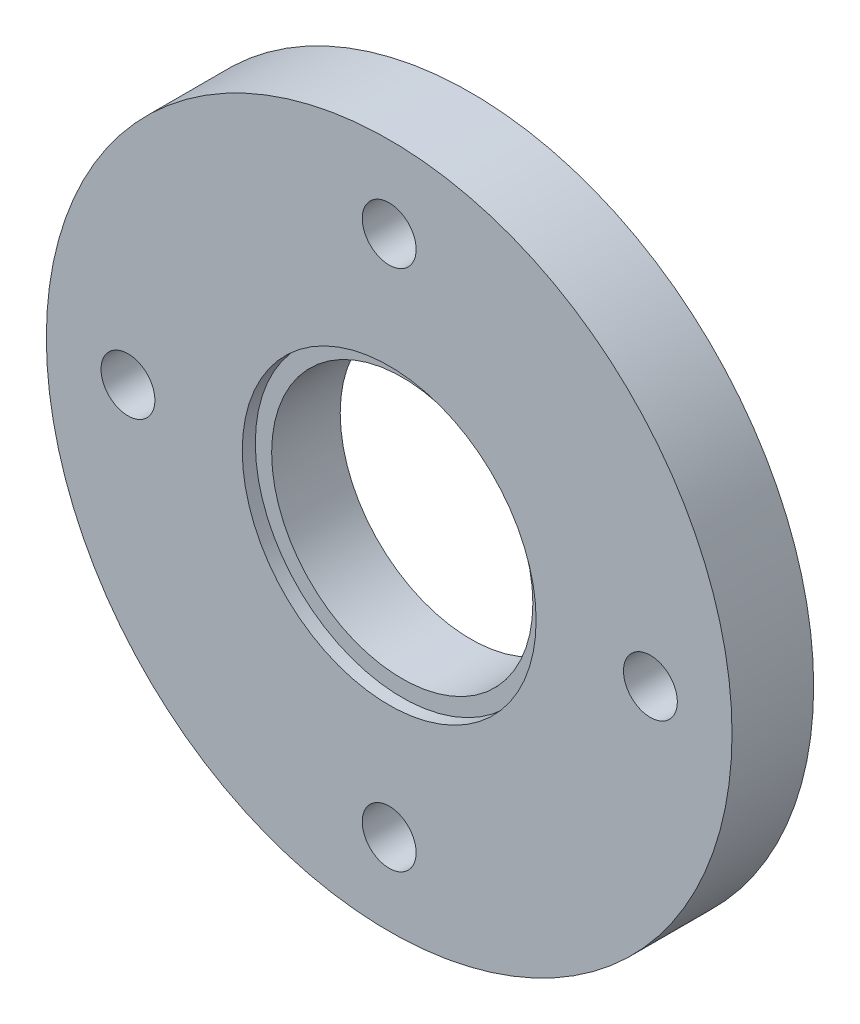
ISO-10303-21;
HEADER;
FILE_DESCRIPTION(('STEP AP214'),'2;1');
FILE_NAME('part.step','',(''),(''),'','','');
FILE_SCHEMA(('AUTOMOTIVE_DESIGN { 1 0 10303 214 1 1 1 1 }'));
ENDSEC;
DATA;
#1=APPLICATION_CONTEXT('core data for automotive mechanical design processes');
#2=APPLICATION_PROTOCOL_DEFINITION('international standard','automotive_design',2000,#1);
#3=PRODUCT_CONTEXT('',#1,'mechanical');
#4=PRODUCT('Part','Part','',(#3));
#5=PRODUCT_RELATED_PRODUCT_CATEGORY('part','',(#4));
#6=PRODUCT_DEFINITION_FORMATION('','',#4);
#7=PRODUCT_DEFINITION_CONTEXT('part definition',#1,'design');
#8=PRODUCT_DEFINITION('design','',#6,#7);
#9=PRODUCT_DEFINITION_SHAPE('','',#8);
#10=(LENGTH_UNIT() NAMED_UNIT(*) SI_UNIT(.MILLI.,.METRE.));
#11=(NAMED_UNIT(*) PLANE_ANGLE_UNIT() SI_UNIT($,.RADIAN.));
#12=(NAMED_UNIT(*) SI_UNIT($,.STERADIAN.) SOLID_ANGLE_UNIT());
#13=UNCERTAINTY_MEASURE_WITH_UNIT(LENGTH_MEASURE(1.E-05),#10,'distance_accuracy_value','');
#14=(GEOMETRIC_REPRESENTATION_CONTEXT(3) GLOBAL_UNCERTAINTY_ASSIGNED_CONTEXT((#13)) GLOBAL_UNIT_ASSIGNED_CONTEXT((#10,
#11,#12)) REPRESENTATION_CONTEXT('',''));
#15=CARTESIAN_POINT('',(0.,0.,0.));
#16=DIRECTION('',(0.,0.,1.));
#17=DIRECTION('',(1.,0.,0.));
#18=AXIS2_PLACEMENT_3D('',#15,#16,#17);
#19=CARTESIAN_POINT('',(0.,0.,5.));
#20=DIRECTION('',(0.,0.,-1.));
#21=DIRECTION('',(-1.,0.,0.));
#22=AXIS2_PLACEMENT_3D('',#19,#20,#21);
#23=CYLINDRICAL_SURFACE('',#22,8.);
#24=CARTESIAN_POINT('',(0.,0.,0.));
#25=DIRECTION('',(0.,0.,1.));
#26=DIRECTION('',(1.,0.,0.));
#27=AXIS2_PLACEMENT_3D('',#24,#25,#26);
#28=CIRCLE('',#27,8.);
#29=CARTESIAN_POINT('',(8.,0.,0.));
#30=VERTEX_POINT('',#29);
#31=EDGE_CURVE('E48',#30,#30,#28,.T.);
#32=ORIENTED_EDGE('',*,*,#31,.F.);
#33=EDGE_LOOP('',(#32));
#34=FACE_BOUND('',#33,.T.);
#35=CARTESIAN_POINT('',(0.,0.,4.2));
#36=DIRECTION('',(0.,0.,1.));
#37=DIRECTION('',(1.,0.,0.));
#38=AXIS2_PLACEMENT_3D('',#35,#36,#37);
#39=CIRCLE('',#38,8.);
#40=CARTESIAN_POINT('',(8.,0.,4.2));
#41=VERTEX_POINT('',#40);
#42=EDGE_CURVE('E39',#41,#41,#39,.T.);
#43=ORIENTED_EDGE('',*,*,#42,.T.);
#44=EDGE_LOOP('',(#43));
#45=FACE_BOUND('',#44,.T.);
#46=ADVANCED_FACE('F35',(#34,#45),#23,.F.);
#47=CARTESIAN_POINT('',(0.,0.,5.));
#48=DIRECTION('',(0.,0.,1.));
#49=DIRECTION('',(1.,0.,0.));
#50=AXIS2_PLACEMENT_3D('',#47,#48,#49);
#51=PLANE('',#50);
#52=CARTESIAN_POINT('',(0.,0.,5.));
#53=DIRECTION('',(0.,0.,1.));
#54=DIRECTION('',(1.,0.,0.));
#55=AXIS2_PLACEMENT_3D('',#52,#53,#54);
#56=CIRCLE('',#55,9.);
#57=CARTESIAN_POINT('',(9.,0.,5.));
#58=VERTEX_POINT('',#57);
#59=EDGE_CURVE('E76',#58,#58,#56,.T.);
#60=ORIENTED_EDGE('',*,*,#59,.F.);
#61=EDGE_LOOP('',(#60));
#62=FACE_BOUND('',#61,.T.);
#63=CARTESIAN_POINT('',(0.,16.,5.));
#64=DIRECTION('',(0.,0.,1.));
#65=DIRECTION('',(1.,0.,0.));
#66=AXIS2_PLACEMENT_3D('',#63,#64,#65);
#67=CIRCLE('',#66,1.64999999999999);
#68=CARTESIAN_POINT('',(1.64999999999999,16.,5.));
#69=VERTEX_POINT('',#68);
#70=EDGE_CURVE('E73',#69,#69,#67,.T.);
#71=ORIENTED_EDGE('',*,*,#70,.F.);
#72=EDGE_LOOP('',(#71));
#73=FACE_BOUND('',#72,.T.);
#74=CARTESIAN_POINT('',(-16.,0.,5.));
#75=DIRECTION('',(0.,0.,1.));
#76=DIRECTION('',(1.,0.,0.));
#77=AXIS2_PLACEMENT_3D('',#74,#75,#76);
#78=CIRCLE('',#77,1.64999999999999);
#79=CARTESIAN_POINT('',(-14.35,0.,5.));
#80=VERTEX_POINT('',#79);
#81=EDGE_CURVE('E67',#80,#80,#78,.T.);
#82=ORIENTED_EDGE('',*,*,#81,.F.);
#83=EDGE_LOOP('',(#82));
#84=FACE_BOUND('',#83,.T.);
#85=CARTESIAN_POINT('',(0.,-16.,5.));
#86=DIRECTION('',(0.,0.,1.));
#87=DIRECTION('',(1.,0.,0.));
#88=AXIS2_PLACEMENT_3D('',#85,#86,#87);
#89=CIRCLE('',#88,1.64999999999999);
#90=CARTESIAN_POINT('',(1.64999999999999,-16.,5.));
#91=VERTEX_POINT('',#90);
#92=EDGE_CURVE('E61',#91,#91,#89,.T.);
#93=ORIENTED_EDGE('',*,*,#92,.F.);
#94=EDGE_LOOP('',(#93));
#95=FACE_BOUND('',#94,.T.);
#96=CARTESIAN_POINT('',(16.,0.,5.));
#97=DIRECTION('',(0.,0.,1.));
#98=DIRECTION('',(1.,0.,0.));
#99=AXIS2_PLACEMENT_3D('',#96,#97,#98);
#100=CIRCLE('',#99,1.64999999999999);
#101=CARTESIAN_POINT('',(17.65,0.,5.));
#102=VERTEX_POINT('',#101);
#103=EDGE_CURVE('E55',#102,#102,#100,.T.);
#104=ORIENTED_EDGE('',*,*,#103,.F.);
#105=EDGE_LOOP('',(#104));
#106=FACE_BOUND('',#105,.T.);
#107=CARTESIAN_POINT('',(0.,0.,5.));
#108=DIRECTION('',(0.,0.,1.));
#109=DIRECTION('',(1.,0.,0.));
#110=AXIS2_PLACEMENT_3D('',#107,#108,#109);
#111=CIRCLE('',#110,21.);
#112=CARTESIAN_POINT('',(21.,0.,5.));
#113=VERTEX_POINT('',#112);
#114=EDGE_CURVE('E10',#113,#113,#111,.T.);
#115=ORIENTED_EDGE('',*,*,#114,.T.);
#116=EDGE_LOOP('',(#115));
#117=FACE_BOUND('',#116,.T.);
#118=ADVANCED_FACE('F98',(#62,#73,#84,#95,#106,#117),#51,.T.);
#119=CARTESIAN_POINT('',(0.,0.,0.));
#120=DIRECTION('',(0.,0.,1.));
#121=DIRECTION('',(1.,0.,0.));
#122=AXIS2_PLACEMENT_3D('',#119,#120,#121);
#123=PLANE('',#122);
#124=CARTESIAN_POINT('',(0.,16.,0.));
#125=DIRECTION('',(0.,0.,1.));
#126=DIRECTION('',(1.,0.,0.));
#127=AXIS2_PLACEMENT_3D('',#124,#125,#126);
#128=CIRCLE('',#127,1.65);
#129=CARTESIAN_POINT('',(1.65,16.,0.));
#130=VERTEX_POINT('',#129);
#131=EDGE_CURVE('E70',#130,#130,#128,.T.);
#132=ORIENTED_EDGE('',*,*,#131,.T.);
#133=EDGE_LOOP('',(#132));
#134=FACE_BOUND('',#133,.T.);
#135=CARTESIAN_POINT('',(-16.,0.,0.));
#136=DIRECTION('',(0.,0.,1.));
#137=DIRECTION('',(1.,0.,0.));
#138=AXIS2_PLACEMENT_3D('',#135,#136,#137);
#139=CIRCLE('',#138,1.65);
#140=CARTESIAN_POINT('',(-14.35,0.,0.));
#141=VERTEX_POINT('',#140);
#142=EDGE_CURVE('E64',#141,#141,#139,.T.);
#143=ORIENTED_EDGE('',*,*,#142,.T.);
#144=EDGE_LOOP('',(#143));
#145=FACE_BOUND('',#144,.T.);
#146=CARTESIAN_POINT('',(0.,-16.,0.));
#147=DIRECTION('',(0.,0.,1.));
#148=DIRECTION('',(1.,0.,0.));
#149=AXIS2_PLACEMENT_3D('',#146,#147,#148);
#150=CIRCLE('',#149,1.65);
#151=CARTESIAN_POINT('',(1.65,-16.,0.));
#152=VERTEX_POINT('',#151);
#153=EDGE_CURVE('E58',#152,#152,#150,.T.);
#154=ORIENTED_EDGE('',*,*,#153,.T.);
#155=EDGE_LOOP('',(#154));
#156=FACE_BOUND('',#155,.T.);
#157=CARTESIAN_POINT('',(16.,0.,0.));
#158=DIRECTION('',(0.,0.,1.));
#159=DIRECTION('',(1.,0.,0.));
#160=AXIS2_PLACEMENT_3D('',#157,#158,#159);
#161=CIRCLE('',#160,1.65);
#162=CARTESIAN_POINT('',(17.65,0.,0.));
#163=VERTEX_POINT('',#162);
#164=EDGE_CURVE('E52',#163,#163,#161,.T.);
#165=ORIENTED_EDGE('',*,*,#164,.T.);
#166=EDGE_LOOP('',(#165));
#167=FACE_BOUND('',#166,.T.);
#168=CARTESIAN_POINT('',(0.,0.,0.));
#169=DIRECTION('',(0.,0.,1.));
#170=DIRECTION('',(1.,0.,0.));
#171=AXIS2_PLACEMENT_3D('',#168,#169,#170);
#172=CIRCLE('',#171,21.);
#173=CARTESIAN_POINT('',(21.,0.,0.));
#174=VERTEX_POINT('',#173);
#175=EDGE_CURVE('E43',#174,#174,#172,.T.);
#176=ORIENTED_EDGE('',*,*,#175,.F.);
#177=EDGE_LOOP('',(#176));
#178=FACE_BOUND('',#177,.T.);
#179=ORIENTED_EDGE('',*,*,#31,.T.);
#180=EDGE_LOOP('',(#179));
#181=FACE_BOUND('',#180,.T.);
#182=ADVANCED_FACE('F104',(#134,#145,#156,#167,#178,#181),#123,.F.);
#183=CARTESIAN_POINT('',(0.,0.,5.));
#184=DIRECTION('',(0.,0.,-1.));
#185=DIRECTION('',(-1.,0.,0.));
#186=AXIS2_PLACEMENT_3D('',#183,#184,#185);
#187=CYLINDRICAL_SURFACE('',#186,21.);
#188=ORIENTED_EDGE('',*,*,#114,.F.);
#189=EDGE_LOOP('',(#188));
#190=FACE_BOUND('',#189,.T.);
#191=ORIENTED_EDGE('',*,*,#175,.T.);
#192=EDGE_LOOP('',(#191));
#193=FACE_BOUND('',#192,.T.);
#194=ADVANCED_FACE('F37',(#190,#193),#187,.T.);
#195=CARTESIAN_POINT('',(16.,0.,5.));
#196=DIRECTION('',(0.,0.,1.));
#197=DIRECTION('',(1.,0.,0.));
#198=AXIS2_PLACEMENT_3D('',#195,#196,#197);
#199=CYLINDRICAL_SURFACE('',#198,1.64999999999999);
#200=ORIENTED_EDGE('',*,*,#164,.F.);
#201=EDGE_LOOP('',(#200));
#202=FACE_BOUND('',#201,.T.);
#203=ORIENTED_EDGE('',*,*,#103,.T.);
#204=EDGE_LOOP('',(#203));
#205=FACE_BOUND('',#204,.T.);
#206=ADVANCED_FACE('F109',(#202,#205),#199,.F.);
#207=CARTESIAN_POINT('',(0.,-16.,5.));
#208=DIRECTION('',(0.,0.,1.));
#209=DIRECTION('',(1.,0.,0.));
#210=AXIS2_PLACEMENT_3D('',#207,#208,#209);
#211=CYLINDRICAL_SURFACE('',#210,1.64999999999999);
#212=ORIENTED_EDGE('',*,*,#153,.F.);
#213=EDGE_LOOP('',(#212));
#214=FACE_BOUND('',#213,.T.);
#215=ORIENTED_EDGE('',*,*,#92,.T.);
#216=EDGE_LOOP('',(#215));
#217=FACE_BOUND('',#216,.T.);
#218=ADVANCED_FACE('F131',(#214,#217),#211,.F.);
#219=CARTESIAN_POINT('',(-16.,0.,5.));
#220=DIRECTION('',(0.,0.,1.));
#221=DIRECTION('',(1.,0.,0.));
#222=AXIS2_PLACEMENT_3D('',#219,#220,#221);
#223=CYLINDRICAL_SURFACE('',#222,1.64999999999999);
#224=ORIENTED_EDGE('',*,*,#142,.F.);
#225=EDGE_LOOP('',(#224));
#226=FACE_BOUND('',#225,.T.);
#227=ORIENTED_EDGE('',*,*,#81,.T.);
#228=EDGE_LOOP('',(#227));
#229=FACE_BOUND('',#228,.T.);
#230=ADVANCED_FACE('F137',(#226,#229),#223,.F.);
#231=CARTESIAN_POINT('',(0.,16.,5.));
#232=DIRECTION('',(0.,0.,1.));
#233=DIRECTION('',(1.,0.,0.));
#234=AXIS2_PLACEMENT_3D('',#231,#232,#233);
#235=CYLINDRICAL_SURFACE('',#234,1.64999999999999);
#236=ORIENTED_EDGE('',*,*,#131,.F.);
#237=EDGE_LOOP('',(#236));
#238=FACE_BOUND('',#237,.T.);
#239=ORIENTED_EDGE('',*,*,#70,.T.);
#240=EDGE_LOOP('',(#239));
#241=FACE_BOUND('',#240,.T.);
#242=ADVANCED_FACE('F94',(#238,#241),#235,.F.);
#243=CARTESIAN_POINT('',(0.,0.,4.2));
#244=DIRECTION('',(0.,0.,1.));
#245=DIRECTION('',(1.,0.,0.));
#246=AXIS2_PLACEMENT_3D('',#243,#244,#245);
#247=CYLINDRICAL_SURFACE('',#246,9.);
#248=CARTESIAN_POINT('',(0.,0.,4.2));
#249=DIRECTION('',(0.,0.,1.));
#250=DIRECTION('',(1.,0.,0.));
#251=AXIS2_PLACEMENT_3D('',#248,#249,#250);
#252=CIRCLE('',#251,9.);
#253=CARTESIAN_POINT('',(9.,0.,4.2));
#254=VERTEX_POINT('',#253);
#255=EDGE_CURVE('E79',#254,#254,#252,.T.);
#256=ORIENTED_EDGE('',*,*,#255,.F.);
#257=EDGE_LOOP('',(#256));
#258=FACE_BOUND('',#257,.T.);
#259=ORIENTED_EDGE('',*,*,#59,.T.);
#260=EDGE_LOOP('',(#259));
#261=FACE_BOUND('',#260,.T.);
#262=ADVANCED_FACE('F89',(#258,#261),#247,.F.);
#263=CARTESIAN_POINT('',(0.,0.,4.2));
#264=DIRECTION('',(0.,0.,1.));
#265=DIRECTION('',(1.,0.,0.));
#266=AXIS2_PLACEMENT_3D('',#263,#264,#265);
#267=PLANE('',#266);
#268=ORIENTED_EDGE('',*,*,#42,.F.);
#269=EDGE_LOOP('',(#268));
#270=FACE_BOUND('',#269,.T.);
#271=ORIENTED_EDGE('',*,*,#255,.T.);
#272=EDGE_LOOP('',(#271));
#273=FACE_BOUND('',#272,.T.);
#274=ADVANCED_FACE('F87',(#270,#273),#267,.T.);
#275=CLOSED_SHELL('',(#46,#118,#182,#194,#206,#218,#230,#242,#262,#274));
#276=MANIFOLD_SOLID_BREP('B2',#275);
#277=ADVANCED_BREP_SHAPE_REPRESENTATION('',(#18,#276),#14);
#278=SHAPE_DEFINITION_REPRESENTATION(#9,#277);
ENDSEC;
END-ISO-10303-21;
